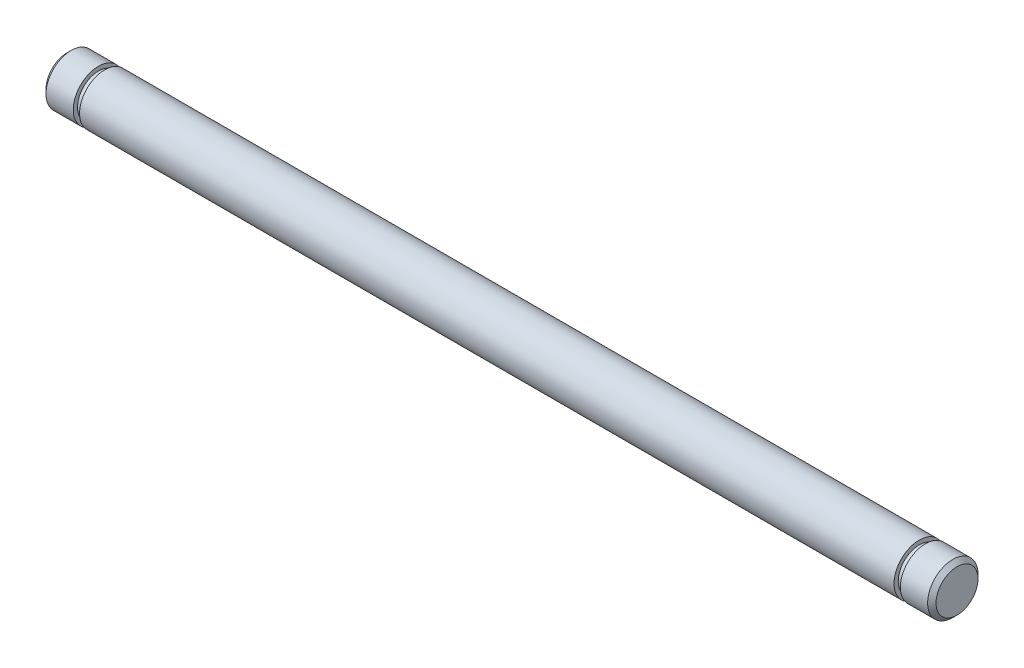
ISO-10303-21;
HEADER;
FILE_DESCRIPTION(('STEP AP214'),'2;1');
FILE_NAME('part.step','',(''),(''),'','','');
FILE_SCHEMA(('AUTOMOTIVE_DESIGN { 1 0 10303 214 1 1 1 1 }'));
ENDSEC;
DATA;
#1=APPLICATION_CONTEXT('core data for automotive mechanical design processes');
#2=APPLICATION_PROTOCOL_DEFINITION('international standard','automotive_design',2000,#1);
#3=PRODUCT_CONTEXT('',#1,'mechanical');
#4=PRODUCT('Part','Part','',(#3));
#5=PRODUCT_RELATED_PRODUCT_CATEGORY('part','',(#4));
#6=PRODUCT_DEFINITION_FORMATION('','',#4);
#7=PRODUCT_DEFINITION_CONTEXT('part definition',#1,'design');
#8=PRODUCT_DEFINITION('design','',#6,#7);
#9=PRODUCT_DEFINITION_SHAPE('','',#8);
#10=(LENGTH_UNIT() NAMED_UNIT(*) SI_UNIT(.MILLI.,.METRE.));
#11=(NAMED_UNIT(*) PLANE_ANGLE_UNIT() SI_UNIT($,.RADIAN.));
#12=(NAMED_UNIT(*) SI_UNIT($,.STERADIAN.) SOLID_ANGLE_UNIT());
#13=UNCERTAINTY_MEASURE_WITH_UNIT(LENGTH_MEASURE(1.E-05),#10,'distance_accuracy_value','');
#14=(GEOMETRIC_REPRESENTATION_CONTEXT(3) GLOBAL_UNCERTAINTY_ASSIGNED_CONTEXT((#13)) GLOBAL_UNIT_ASSIGNED_CONTEXT((#10,
#11,#12)) REPRESENTATION_CONTEXT('',''));
#15=CARTESIAN_POINT('',(0.,0.,0.));
#16=DIRECTION('',(0.,0.,1.));
#17=DIRECTION('',(1.,0.,0.));
#18=AXIS2_PLACEMENT_3D('',#15,#16,#17);
#19=CARTESIAN_POINT('',(0.,1.5,0.));
#20=DIRECTION('',(1.,0.,0.));
#21=DIRECTION('',(0.,0.,-1.));
#22=AXIS2_PLACEMENT_3D('',#19,#20,#21);
#23=PLANE('',#22);
#24=CARTESIAN_POINT('',(2.84216769043388E-10,0.,0.));
#25=DIRECTION('',(-1.,0.,0.));
#26=DIRECTION('',(0.,-1.,0.));
#27=AXIS2_PLACEMENT_3D('',#24,#25,#26);
#28=CIRCLE('',#27,2.50000000016826);
#29=CARTESIAN_POINT('',(2.84217085269022E-10,-2.50000000016826,0.));
#30=VERTEX_POINT('',#29);
#31=EDGE_CURVE('E18',#30,#30,#28,.T.);
#32=ORIENTED_EDGE('',*,*,#31,.F.);
#33=EDGE_LOOP('',(#32));
#34=FACE_BOUND('',#33,.T.);
#35=ADVANCED_FACE('F15',(#34),#23,.T.);
#36=CARTESIAN_POINT('',(-106.,1.49999999999998,0.));
#37=DIRECTION('',(-1.,0.,0.));
#38=DIRECTION('',(0.,0.,1.));
#39=AXIS2_PLACEMENT_3D('',#36,#37,#38);
#40=PLANE('',#39);
#41=CARTESIAN_POINT('',(-106.000000000165,0.,0.));
#42=DIRECTION('',(1.,0.,0.));
#43=DIRECTION('',(0.,0.,-1.));
#44=AXIS2_PLACEMENT_3D('',#41,#42,#43);
#45=CIRCLE('',#44,2.50000000022509);
#46=CARTESIAN_POINT('',(-106.000000000165,0.,-2.50000000022509));
#47=VERTEX_POINT('',#46);
#48=EDGE_CURVE('E50',#47,#47,#45,.T.);
#49=ORIENTED_EDGE('',*,*,#48,.F.);
#50=EDGE_LOOP('',(#49));
#51=FACE_BOUND('',#50,.T.);
#52=ADVANCED_FACE('F63',(#51),#40,.T.);
#53=CARTESIAN_POINT('',(-0.500000000101864,0.,0.));
#54=DIRECTION('',(-1.,0.,0.));
#55=DIRECTION('',(0.,-1.,0.));
#56=AXIS2_PLACEMENT_3D('',#53,#54,#55);
#57=CONICAL_SURFACE('',#56,2.99999999970169,0.785398162544797);
#58=ORIENTED_EDGE('',*,*,#31,.T.);
#59=EDGE_LOOP('',(#58));
#60=FACE_BOUND('',#59,.T.);
#61=CARTESIAN_POINT('',(-0.5,0.,0.));
#62=DIRECTION('',(1.,0.,0.));
#63=DIRECTION('',(0.,1.,0.));
#64=AXIS2_PLACEMENT_3D('',#61,#62,#63);
#65=CIRCLE('',#64,3.);
#66=CARTESIAN_POINT('',(-0.500000000000001,3.,0.));
#67=VERTEX_POINT('',#66);
#68=EDGE_CURVE('E52',#67,#67,#65,.F.);
#69=ORIENTED_EDGE('',*,*,#68,.F.);
#70=EDGE_LOOP('',(#69));
#71=FACE_BOUND('',#70,.T.);
#72=ADVANCED_FACE('F59',(#60,#71),#57,.T.);
#73=CARTESIAN_POINT('',(-105.499999999722,0.,0.));
#74=DIRECTION('',(1.,0.,0.));
#75=DIRECTION('',(0.,0.,-1.));
#76=AXIS2_PLACEMENT_3D('',#73,#74,#75);
#77=CONICAL_SURFACE('',#76,2.99999999975852,0.785398162487954);
#78=CARTESIAN_POINT('',(-105.5,0.,0.));
#79=DIRECTION('',(1.,0.,0.));
#80=DIRECTION('',(0.,1.,0.));
#81=AXIS2_PLACEMENT_3D('',#78,#79,#80);
#82=CIRCLE('',#81,2.99999999999999);
#83=CARTESIAN_POINT('',(-105.5,2.99999999999998,0.));
#84=VERTEX_POINT('',#83);
#85=EDGE_CURVE('E49',#84,#84,#82,.T.);
#86=ORIENTED_EDGE('',*,*,#85,.F.);
#87=EDGE_LOOP('',(#86));
#88=FACE_BOUND('',#87,.T.);
#89=ORIENTED_EDGE('',*,*,#48,.T.);
#90=EDGE_LOOP('',(#89));
#91=FACE_BOUND('',#90,.T.);
#92=ADVANCED_FACE('F107',(#88,#91),#77,.T.);
#93=CARTESIAN_POINT('',(-1.875,0.,0.));
#94=DIRECTION('',(1.,0.,0.));
#95=DIRECTION('',(0.,1.,0.));
#96=AXIS2_PLACEMENT_3D('',#93,#94,#95);
#97=CYLINDRICAL_SURFACE('',#96,3.);
#98=ORIENTED_EDGE('',*,*,#68,.T.);
#99=EDGE_LOOP('',(#98));
#100=FACE_BOUND('',#99,.T.);
#101=CARTESIAN_POINT('',(-3.75,0.,0.));
#102=DIRECTION('',(1.,0.,0.));
#103=DIRECTION('',(0.,1.,0.));
#104=AXIS2_PLACEMENT_3D('',#101,#102,#103);
#105=CIRCLE('',#104,3.);
#106=CARTESIAN_POINT('',(-3.75,3.,0.));
#107=VERTEX_POINT('',#106);
#108=EDGE_CURVE('E47',#107,#107,#105,.F.);
#109=ORIENTED_EDGE('',*,*,#108,.F.);
#110=EDGE_LOOP('',(#109));
#111=FACE_BOUND('',#110,.T.);
#112=ADVANCED_FACE('F103',(#100,#111),#97,.T.);
#113=CARTESIAN_POINT('',(-104.125,0.,0.));
#114=DIRECTION('',(1.,0.,0.));
#115=DIRECTION('',(0.,1.,0.));
#116=AXIS2_PLACEMENT_3D('',#113,#114,#115);
#117=CYLINDRICAL_SURFACE('',#116,2.99999999999999);
#118=ORIENTED_EDGE('',*,*,#85,.T.);
#119=EDGE_LOOP('',(#118));
#120=FACE_BOUND('',#119,.T.);
#121=CARTESIAN_POINT('',(-102.25,0.,0.));
#122=DIRECTION('',(1.,0.,0.));
#123=DIRECTION('',(0.,1.,0.));
#124=AXIS2_PLACEMENT_3D('',#121,#122,#123);
#125=CIRCLE('',#124,2.99999999999999);
#126=CARTESIAN_POINT('',(-102.25,2.99999999999998,0.));
#127=VERTEX_POINT('',#126);
#128=EDGE_CURVE('E44',#127,#127,#125,.T.);
#129=ORIENTED_EDGE('',*,*,#128,.F.);
#130=EDGE_LOOP('',(#129));
#131=FACE_BOUND('',#130,.T.);
#132=ADVANCED_FACE('F99',(#120,#131),#117,.T.);
#133=CARTESIAN_POINT('',(-3.75,2.75000000000004,0.));
#134=DIRECTION('',(-1.,0.,0.));
#135=DIRECTION('',(0.,0.,1.));
#136=AXIS2_PLACEMENT_3D('',#133,#134,#135);
#137=PLANE('',#136);
#138=CARTESIAN_POINT('',(-3.75,0.,0.));
#139=DIRECTION('',(1.,0.,0.));
#140=DIRECTION('',(0.,1.,0.));
#141=AXIS2_PLACEMENT_3D('',#138,#139,#140);
#142=CIRCLE('',#141,2.50000000000008);
#143=CARTESIAN_POINT('',(-3.75,2.50000000000008,0.));
#144=VERTEX_POINT('',#143);
#145=EDGE_CURVE('E41',#144,#144,#142,.F.);
#146=ORIENTED_EDGE('',*,*,#145,.F.);
#147=EDGE_LOOP('',(#146));
#148=FACE_BOUND('',#147,.T.);
#149=ORIENTED_EDGE('',*,*,#108,.T.);
#150=EDGE_LOOP('',(#149));
#151=FACE_BOUND('',#150,.T.);
#152=ADVANCED_FACE('F95',(#148,#151),#137,.T.);
#153=CARTESIAN_POINT('',(-102.25,2.74999999999998,0.));
#154=DIRECTION('',(1.,0.,0.));
#155=DIRECTION('',(0.,0.,-1.));
#156=AXIS2_PLACEMENT_3D('',#153,#154,#155);
#157=PLANE('',#156);
#158=CARTESIAN_POINT('',(-102.25,0.,0.));
#159=DIRECTION('',(1.,0.,0.));
#160=DIRECTION('',(0.,1.,0.));
#161=AXIS2_PLACEMENT_3D('',#158,#159,#160);
#162=CIRCLE('',#161,2.5);
#163=CARTESIAN_POINT('',(-102.25,2.49999999999999,0.));
#164=VERTEX_POINT('',#163);
#165=EDGE_CURVE('E38',#164,#164,#162,.T.);
#166=ORIENTED_EDGE('',*,*,#165,.F.);
#167=EDGE_LOOP('',(#166));
#168=FACE_BOUND('',#167,.T.);
#169=ORIENTED_EDGE('',*,*,#128,.T.);
#170=EDGE_LOOP('',(#169));
#171=FACE_BOUND('',#170,.T.);
#172=ADVANCED_FACE('F91',(#168,#171),#157,.T.);
#173=CARTESIAN_POINT('',(-4.125,0.,0.));
#174=DIRECTION('',(1.,0.,0.));
#175=DIRECTION('',(0.,1.,0.));
#176=AXIS2_PLACEMENT_3D('',#173,#174,#175);
#177=CYLINDRICAL_SURFACE('',#176,2.50000000000008);
#178=CARTESIAN_POINT('',(-4.5,0.,0.));
#179=DIRECTION('',(1.,0.,0.));
#180=DIRECTION('',(0.,1.,0.));
#181=AXIS2_PLACEMENT_3D('',#178,#179,#180);
#182=CIRCLE('',#181,2.50000000000008);
#183=CARTESIAN_POINT('',(-4.5,2.50000000000008,0.));
#184=VERTEX_POINT('',#183);
#185=EDGE_CURVE('E35',#184,#184,#182,.F.);
#186=ORIENTED_EDGE('',*,*,#185,.F.);
#187=EDGE_LOOP('',(#186));
#188=FACE_BOUND('',#187,.T.);
#189=ORIENTED_EDGE('',*,*,#145,.T.);
#190=EDGE_LOOP('',(#189));
#191=FACE_BOUND('',#190,.T.);
#192=ADVANCED_FACE('F87',(#188,#191),#177,.T.);
#193=CARTESIAN_POINT('',(-101.875,0.,0.));
#194=DIRECTION('',(1.,0.,0.));
#195=DIRECTION('',(0.,1.,0.));
#196=AXIS2_PLACEMENT_3D('',#193,#194,#195);
#197=CYLINDRICAL_SURFACE('',#196,2.5);
#198=ORIENTED_EDGE('',*,*,#165,.T.);
#199=EDGE_LOOP('',(#198));
#200=FACE_BOUND('',#199,.T.);
#201=CARTESIAN_POINT('',(-101.5,0.,0.));
#202=DIRECTION('',(1.,0.,0.));
#203=DIRECTION('',(0.,1.,0.));
#204=AXIS2_PLACEMENT_3D('',#201,#202,#203);
#205=CIRCLE('',#204,2.5);
#206=CARTESIAN_POINT('',(-101.5,2.49999999999999,0.));
#207=VERTEX_POINT('',#206);
#208=EDGE_CURVE('E27',#207,#207,#205,.T.);
#209=ORIENTED_EDGE('',*,*,#208,.F.);
#210=EDGE_LOOP('',(#209));
#211=FACE_BOUND('',#210,.T.);
#212=ADVANCED_FACE('F83',(#200,#211),#197,.T.);
#213=CARTESIAN_POINT('',(-4.5,2.75000000000004,0.));
#214=DIRECTION('',(1.,0.,0.));
#215=DIRECTION('',(0.,0.,-1.));
#216=AXIS2_PLACEMENT_3D('',#213,#214,#215);
#217=PLANE('',#216);
#218=ORIENTED_EDGE('',*,*,#185,.T.);
#219=EDGE_LOOP('',(#218));
#220=FACE_BOUND('',#219,.T.);
#221=CARTESIAN_POINT('',(-4.5,0.,0.));
#222=DIRECTION('',(1.,0.,0.));
#223=DIRECTION('',(0.,1.,0.));
#224=AXIS2_PLACEMENT_3D('',#221,#222,#223);
#225=CIRCLE('',#224,2.99999999999999);
#226=CARTESIAN_POINT('',(-4.5,2.99999999999999,0.));
#227=VERTEX_POINT('',#226);
#228=EDGE_CURVE('E22',#227,#227,#225,.F.);
#229=ORIENTED_EDGE('',*,*,#228,.F.);
#230=EDGE_LOOP('',(#229));
#231=FACE_BOUND('',#230,.T.);
#232=ADVANCED_FACE('F76',(#220,#231),#217,.T.);
#233=CARTESIAN_POINT('',(-101.5,2.74999999999998,0.));
#234=DIRECTION('',(-1.,0.,0.));
#235=DIRECTION('',(0.,0.,1.));
#236=AXIS2_PLACEMENT_3D('',#233,#234,#235);
#237=PLANE('',#236);
#238=ORIENTED_EDGE('',*,*,#208,.T.);
#239=EDGE_LOOP('',(#238));
#240=FACE_BOUND('',#239,.T.);
#241=CARTESIAN_POINT('',(-101.5,0.,0.));
#242=DIRECTION('',(1.,0.,0.));
#243=DIRECTION('',(0.,1.,0.));
#244=AXIS2_PLACEMENT_3D('',#241,#242,#243);
#245=CIRCLE('',#244,2.99999999999999);
#246=CARTESIAN_POINT('',(-101.5,2.99999999999998,0.));
#247=VERTEX_POINT('',#246);
#248=EDGE_CURVE('E10',#247,#247,#245,.T.);
#249=ORIENTED_EDGE('',*,*,#248,.F.);
#250=EDGE_LOOP('',(#249));
#251=FACE_BOUND('',#250,.T.);
#252=ADVANCED_FACE('F71',(#240,#251),#237,.T.);
#253=CARTESIAN_POINT('',(-53.,0.,0.));
#254=DIRECTION('',(1.,0.,0.));
#255=DIRECTION('',(0.,1.,0.));
#256=AXIS2_PLACEMENT_3D('',#253,#254,#255);
#257=CYLINDRICAL_SURFACE('',#256,2.99999999999999);
#258=ORIENTED_EDGE('',*,*,#248,.T.);
#259=EDGE_LOOP('',(#258));
#260=FACE_BOUND('',#259,.T.);
#261=ORIENTED_EDGE('',*,*,#228,.T.);
#262=EDGE_LOOP('',(#261));
#263=FACE_BOUND('',#262,.T.);
#264=ADVANCED_FACE('F69',(#260,#263),#257,.T.);
#265=CLOSED_SHELL('',(#35,#52,#72,#92,#112,#132,#152,#172,#192,#212,#232,#252,#264));
#266=MANIFOLD_SOLID_BREP('B1',#265);
#267=ADVANCED_BREP_SHAPE_REPRESENTATION('',(#18,#266),#14);
#268=SHAPE_DEFINITION_REPRESENTATION(#9,#267);
ENDSEC;
END-ISO-10303-21;
